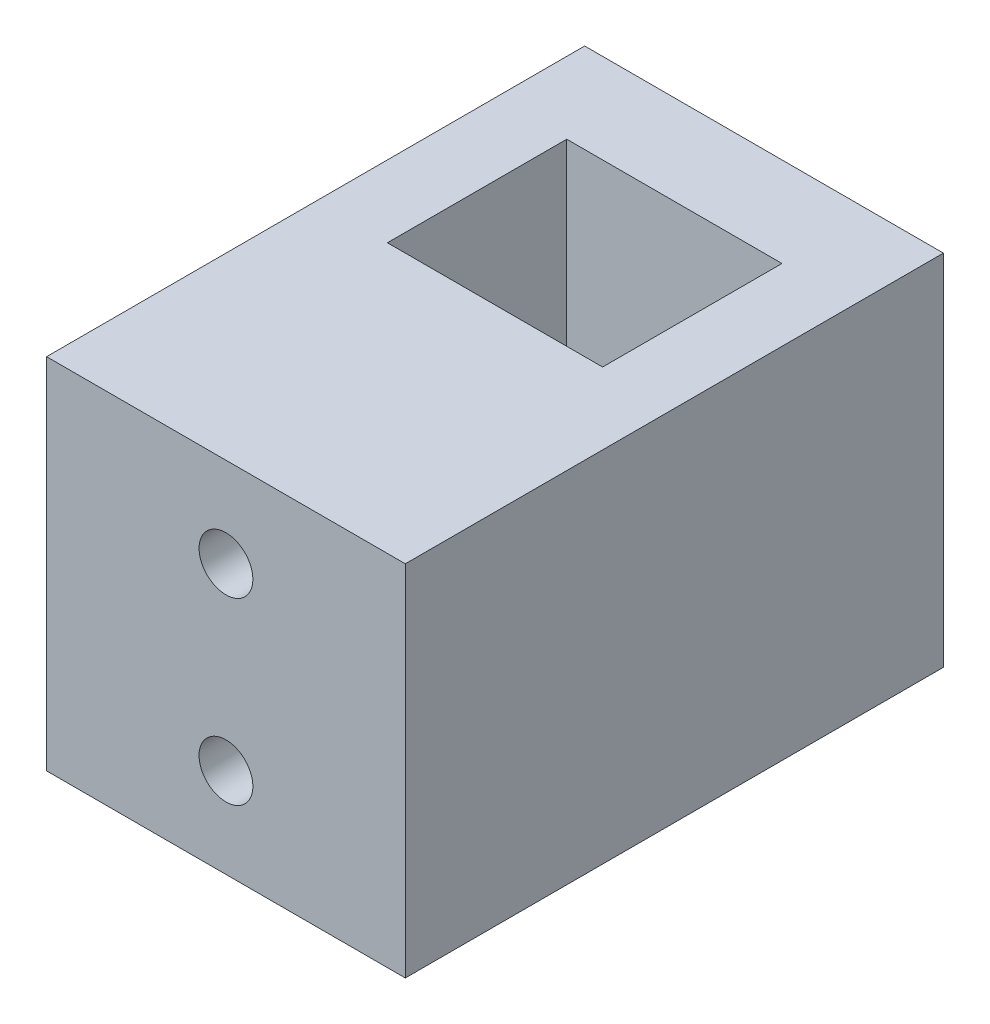
ISO-10303-21;
HEADER;
FILE_DESCRIPTION(('STEP AP214'),'2;1');
FILE_NAME('part.step','',(''),(''),'','','');
FILE_SCHEMA(('AUTOMOTIVE_DESIGN { 1 0 10303 214 1 1 1 1 }'));
ENDSEC;
DATA;
#1=APPLICATION_CONTEXT('core data for automotive mechanical design processes');
#2=APPLICATION_PROTOCOL_DEFINITION('international standard','automotive_design',2000,#1);
#3=PRODUCT_CONTEXT('',#1,'mechanical');
#4=PRODUCT('Part','Part','',(#3));
#5=PRODUCT_RELATED_PRODUCT_CATEGORY('part','',(#4));
#6=PRODUCT_DEFINITION_FORMATION('','',#4);
#7=PRODUCT_DEFINITION_CONTEXT('part definition',#1,'design');
#8=PRODUCT_DEFINITION('design','',#6,#7);
#9=PRODUCT_DEFINITION_SHAPE('','',#8);
#10=(LENGTH_UNIT() NAMED_UNIT(*) SI_UNIT(.MILLI.,.METRE.));
#11=(NAMED_UNIT(*) PLANE_ANGLE_UNIT() SI_UNIT($,.RADIAN.));
#12=(NAMED_UNIT(*) SI_UNIT($,.STERADIAN.) SOLID_ANGLE_UNIT());
#13=UNCERTAINTY_MEASURE_WITH_UNIT(LENGTH_MEASURE(1.E-05),#10,'distance_accuracy_value','');
#14=(GEOMETRIC_REPRESENTATION_CONTEXT(3) GLOBAL_UNCERTAINTY_ASSIGNED_CONTEXT((#13)) GLOBAL_UNIT_ASSIGNED_CONTEXT((#10,
#11,#12)) REPRESENTATION_CONTEXT('',''));
#15=CARTESIAN_POINT('',(0.,0.,0.));
#16=DIRECTION('',(0.,0.,1.));
#17=DIRECTION('',(1.,0.,0.));
#18=AXIS2_PLACEMENT_3D('',#15,#16,#17);
#19=CARTESIAN_POINT('',(10.,20.,-30.));
#20=DIRECTION('',(-1.,0.,0.));
#21=DIRECTION('',(0.,0.,1.));
#22=AXIS2_PLACEMENT_3D('',#19,#20,#21);
#23=PLANE('',#22);
#24=DIRECTION('',(0.,0.,-1.));
#25=VECTOR('',#24,1.);
#26=CARTESIAN_POINT('',(10.,0.,-30.));
#27=LINE('',#26,#25);
#28=CARTESIAN_POINT('',(10.,0.,0.));
#29=VERTEX_POINT('',#28);
#30=CARTESIAN_POINT('',(10.,0.,-30.));
#31=VERTEX_POINT('',#30);
#32=EDGE_CURVE('E145',#29,#31,#27,.T.);
#33=ORIENTED_EDGE('',*,*,#32,.T.);
#34=DIRECTION('',(0.,-1.,0.));
#35=VECTOR('',#34,1.);
#36=CARTESIAN_POINT('',(10.,20.,-30.));
#37=LINE('',#36,#35);
#38=CARTESIAN_POINT('',(10.,20.,-30.));
#39=VERTEX_POINT('',#38);
#40=EDGE_CURVE('E11',#39,#31,#37,.T.);
#41=ORIENTED_EDGE('',*,*,#40,.F.);
#42=DIRECTION('',(0.,0.,-1.));
#43=VECTOR('',#42,1.);
#44=CARTESIAN_POINT('',(10.,20.,-30.));
#45=LINE('',#44,#43);
#46=CARTESIAN_POINT('',(10.,20.,0.));
#47=VERTEX_POINT('',#46);
#48=EDGE_CURVE('E149',#47,#39,#45,.T.);
#49=ORIENTED_EDGE('',*,*,#48,.F.);
#50=DIRECTION('',(0.,-1.,0.));
#51=VECTOR('',#50,1.);
#52=CARTESIAN_POINT('',(10.,20.,0.));
#53=LINE('',#52,#51);
#54=EDGE_CURVE('E155',#47,#29,#53,.T.);
#55=ORIENTED_EDGE('',*,*,#54,.T.);
#56=EDGE_LOOP('',(#33,#41,#49,#55));
#57=FACE_BOUND('',#56,.T.);
#58=ADVANCED_FACE('F33',(#57),#23,.F.);
#59=CARTESIAN_POINT('',(-10.,20.,-30.));
#60=DIRECTION('',(0.,0.,1.));
#61=DIRECTION('',(1.,0.,0.));
#62=AXIS2_PLACEMENT_3D('',#59,#60,#61);
#63=PLANE('',#62);
#64=DIRECTION('',(-1.,0.,0.));
#65=VECTOR('',#64,1.);
#66=CARTESIAN_POINT('',(-10.,0.,-30.));
#67=LINE('',#66,#65);
#68=CARTESIAN_POINT('',(-10.,0.,-30.));
#69=VERTEX_POINT('',#68);
#70=EDGE_CURVE('E158',#31,#69,#67,.T.);
#71=ORIENTED_EDGE('',*,*,#70,.T.);
#72=DIRECTION('',(0.,-1.,0.));
#73=VECTOR('',#72,1.);
#74=CARTESIAN_POINT('',(-10.,20.,-30.));
#75=LINE('',#74,#73);
#76=CARTESIAN_POINT('',(-10.,20.,-30.));
#77=VERTEX_POINT('',#76);
#78=EDGE_CURVE('E41',#77,#69,#75,.T.);
#79=ORIENTED_EDGE('',*,*,#78,.F.);
#80=DIRECTION('',(-1.,0.,0.));
#81=VECTOR('',#80,1.);
#82=CARTESIAN_POINT('',(-10.,20.,-30.));
#83=LINE('',#82,#81);
#84=EDGE_CURVE('E85',#39,#77,#83,.T.);
#85=ORIENTED_EDGE('',*,*,#84,.F.);
#86=ORIENTED_EDGE('',*,*,#40,.T.);
#87=EDGE_LOOP('',(#71,#79,#85,#86));
#88=FACE_BOUND('',#87,.T.);
#89=ADVANCED_FACE('F189',(#88),#63,.F.);
#90=CARTESIAN_POINT('',(-10.,20.,-30.));
#91=DIRECTION('',(1.,0.,0.));
#92=DIRECTION('',(0.,0.,-1.));
#93=AXIS2_PLACEMENT_3D('',#90,#91,#92);
#94=PLANE('',#93);
#95=DIRECTION('',(0.,0.,1.));
#96=VECTOR('',#95,1.);
#97=CARTESIAN_POINT('',(-10.,0.,-30.));
#98=LINE('',#97,#96);
#99=CARTESIAN_POINT('',(-10.,0.,0.));
#100=VERTEX_POINT('',#99);
#101=EDGE_CURVE('E160',#69,#100,#98,.T.);
#102=ORIENTED_EDGE('',*,*,#101,.T.);
#103=DIRECTION('',(0.,-1.,0.));
#104=VECTOR('',#103,1.);
#105=CARTESIAN_POINT('',(-10.,20.,0.));
#106=LINE('',#105,#104);
#107=CARTESIAN_POINT('',(-10.,20.,0.));
#108=VERTEX_POINT('',#107);
#109=EDGE_CURVE('E164',#108,#100,#106,.T.);
#110=ORIENTED_EDGE('',*,*,#109,.F.);
#111=DIRECTION('',(0.,0.,1.));
#112=VECTOR('',#111,1.);
#113=CARTESIAN_POINT('',(-10.,20.,-30.));
#114=LINE('',#113,#112);
#115=EDGE_CURVE('E152',#77,#108,#114,.T.);
#116=ORIENTED_EDGE('',*,*,#115,.F.);
#117=ORIENTED_EDGE('',*,*,#78,.T.);
#118=EDGE_LOOP('',(#102,#110,#116,#117));
#119=FACE_BOUND('',#118,.T.);
#120=ADVANCED_FACE('F170',(#119),#94,.F.);
#121=CARTESIAN_POINT('',(-10.,20.,0.));
#122=DIRECTION('',(0.,0.,-1.));
#123=DIRECTION('',(-1.,0.,0.));
#124=AXIS2_PLACEMENT_3D('',#121,#122,#123);
#125=PLANE('',#124);
#126=CARTESIAN_POINT('',(0.,5.,0.));
#127=DIRECTION('',(0.,0.,1.));
#128=DIRECTION('',(-1.,0.,0.));
#129=AXIS2_PLACEMENT_3D('',#126,#127,#128);
#130=CIRCLE('',#129,1.5);
#131=CARTESIAN_POINT('',(-1.5,5.,0.));
#132=VERTEX_POINT('',#131);
#133=EDGE_CURVE('E325',#132,#132,#130,.T.);
#134=ORIENTED_EDGE('',*,*,#133,.F.);
#135=EDGE_LOOP('',(#134));
#136=FACE_BOUND('',#135,.T.);
#137=CARTESIAN_POINT('',(0.,15.,0.));
#138=DIRECTION('',(0.,0.,1.));
#139=DIRECTION('',(1.,0.,0.));
#140=AXIS2_PLACEMENT_3D('',#137,#138,#139);
#141=CIRCLE('',#140,1.5);
#142=CARTESIAN_POINT('',(1.5,15.,0.));
#143=VERTEX_POINT('',#142);
#144=EDGE_CURVE('E324',#143,#143,#141,.T.);
#145=ORIENTED_EDGE('',*,*,#144,.F.);
#146=EDGE_LOOP('',(#145));
#147=FACE_BOUND('',#146,.T.);
#148=DIRECTION('',(1.,0.,0.));
#149=VECTOR('',#148,1.);
#150=CARTESIAN_POINT('',(-10.,0.,0.));
#151=LINE('',#150,#149);
#152=EDGE_CURVE('E78',#100,#29,#151,.T.);
#153=ORIENTED_EDGE('',*,*,#152,.T.);
#154=ORIENTED_EDGE('',*,*,#54,.F.);
#155=DIRECTION('',(1.,0.,0.));
#156=VECTOR('',#155,1.);
#157=CARTESIAN_POINT('',(-10.,20.,0.));
#158=LINE('',#157,#156);
#159=EDGE_CURVE('E57',#108,#47,#158,.T.);
#160=ORIENTED_EDGE('',*,*,#159,.F.);
#161=ORIENTED_EDGE('',*,*,#109,.T.);
#162=EDGE_LOOP('',(#153,#154,#160,#161));
#163=FACE_BOUND('',#162,.T.);
#164=ADVANCED_FACE('F178',(#136,#147,#163),#125,.F.);
#165=CARTESIAN_POINT('',(0.,20.,0.));
#166=DIRECTION('',(0.,1.,0.));
#167=DIRECTION('',(0.,0.,1.));
#168=AXIS2_PLACEMENT_3D('',#165,#166,#167);
#169=PLANE('',#168);
#170=DIRECTION('',(0.,0.,-1.));
#171=VECTOR('',#170,1.);
#172=CARTESIAN_POINT('',(5.99999999999999,20.,-25.));
#173=LINE('',#172,#171);
#174=CARTESIAN_POINT('',(6.,20.,-15.));
#175=VERTEX_POINT('',#174);
#176=CARTESIAN_POINT('',(5.99999999999999,20.,-25.));
#177=VERTEX_POINT('',#176);
#178=EDGE_CURVE('E48',#175,#177,#173,.T.);
#179=ORIENTED_EDGE('',*,*,#178,.F.);
#180=DIRECTION('',(1.,0.,0.));
#181=VECTOR('',#180,1.);
#182=CARTESIAN_POINT('',(-6.00000000000001,20.,-15.));
#183=LINE('',#182,#181);
#184=CARTESIAN_POINT('',(-6.00000000000001,20.,-15.));
#185=VERTEX_POINT('',#184);
#186=EDGE_CURVE('E127',#185,#175,#183,.T.);
#187=ORIENTED_EDGE('',*,*,#186,.F.);
#188=DIRECTION('',(0.,0.,1.));
#189=VECTOR('',#188,1.);
#190=CARTESIAN_POINT('',(-6.00000000000001,20.,-25.));
#191=LINE('',#190,#189);
#192=CARTESIAN_POINT('',(-6.00000000000001,20.,-25.));
#193=VERTEX_POINT('',#192);
#194=EDGE_CURVE('E130',#193,#185,#191,.T.);
#195=ORIENTED_EDGE('',*,*,#194,.F.);
#196=DIRECTION('',(-1.,0.,0.));
#197=VECTOR('',#196,1.);
#198=CARTESIAN_POINT('',(-6.00000000000001,20.,-25.));
#199=LINE('',#198,#197);
#200=EDGE_CURVE('E139',#177,#193,#199,.T.);
#201=ORIENTED_EDGE('',*,*,#200,.F.);
#202=EDGE_LOOP('',(#179,#187,#195,#201));
#203=FACE_BOUND('',#202,.T.);
#204=ORIENTED_EDGE('',*,*,#48,.T.);
#205=ORIENTED_EDGE('',*,*,#84,.T.);
#206=ORIENTED_EDGE('',*,*,#115,.T.);
#207=ORIENTED_EDGE('',*,*,#159,.T.);
#208=EDGE_LOOP('',(#204,#205,#206,#207));
#209=FACE_BOUND('',#208,.T.);
#210=ADVANCED_FACE('F180',(#203,#209),#169,.T.);
#211=CARTESIAN_POINT('',(0.,0.,0.));
#212=DIRECTION('',(0.,1.,0.));
#213=DIRECTION('',(0.,0.,1.));
#214=AXIS2_PLACEMENT_3D('',#211,#212,#213);
#215=PLANE('',#214);
#216=CARTESIAN_POINT('',(0.,0.,-20.));
#217=DIRECTION('',(0.,1.,0.));
#218=DIRECTION('',(0.,0.,1.));
#219=AXIS2_PLACEMENT_3D('',#216,#217,#218);
#220=CIRCLE('',#219,1.5);
#221=CARTESIAN_POINT('',(0.,0.,-18.5));
#222=VERTEX_POINT('',#221);
#223=EDGE_CURVE('E133',#222,#222,#220,.T.);
#224=ORIENTED_EDGE('',*,*,#223,.T.);
#225=EDGE_LOOP('',(#224));
#226=FACE_BOUND('',#225,.T.);
#227=ORIENTED_EDGE('',*,*,#32,.F.);
#228=ORIENTED_EDGE('',*,*,#152,.F.);
#229=ORIENTED_EDGE('',*,*,#101,.F.);
#230=ORIENTED_EDGE('',*,*,#70,.F.);
#231=EDGE_LOOP('',(#227,#228,#229,#230));
#232=FACE_BOUND('',#231,.T.);
#233=ADVANCED_FACE('F174',(#226,#232),#215,.F.);
#234=CARTESIAN_POINT('',(5.99999999999999,2.,-25.));
#235=DIRECTION('',(1.,0.,0.));
#236=DIRECTION('',(0.,0.,-1.));
#237=AXIS2_PLACEMENT_3D('',#234,#235,#236);
#238=PLANE('',#237);
#239=ORIENTED_EDGE('',*,*,#178,.T.);
#240=DIRECTION('',(0.,1.,0.));
#241=VECTOR('',#240,1.);
#242=CARTESIAN_POINT('',(5.99999999999999,2.,-25.));
#243=LINE('',#242,#241);
#244=CARTESIAN_POINT('',(5.99999999999999,2.,-25.));
#245=VERTEX_POINT('',#244);
#246=EDGE_CURVE('E105',#245,#177,#243,.T.);
#247=ORIENTED_EDGE('',*,*,#246,.F.);
#248=DIRECTION('',(0.,0.,-1.));
#249=VECTOR('',#248,1.);
#250=CARTESIAN_POINT('',(5.99999999999999,2.,-25.));
#251=LINE('',#250,#249);
#252=CARTESIAN_POINT('',(6.,2.,-15.));
#253=VERTEX_POINT('',#252);
#254=EDGE_CURVE('E109',#253,#245,#251,.T.);
#255=ORIENTED_EDGE('',*,*,#254,.F.);
#256=DIRECTION('',(0.,1.,0.));
#257=VECTOR('',#256,1.);
#258=CARTESIAN_POINT('',(6.,2.,-15.));
#259=LINE('',#258,#257);
#260=EDGE_CURVE('E143',#253,#175,#259,.T.);
#261=ORIENTED_EDGE('',*,*,#260,.T.);
#262=EDGE_LOOP('',(#239,#247,#255,#261));
#263=FACE_BOUND('',#262,.T.);
#264=ADVANCED_FACE('F107',(#263),#238,.F.);
#265=CARTESIAN_POINT('',(-6.00000000000001,2.,-15.));
#266=DIRECTION('',(0.,0.,1.));
#267=DIRECTION('',(1.,0.,0.));
#268=AXIS2_PLACEMENT_3D('',#265,#266,#267);
#269=PLANE('',#268);
#270=ORIENTED_EDGE('',*,*,#186,.T.);
#271=ORIENTED_EDGE('',*,*,#260,.F.);
#272=DIRECTION('',(1.,0.,0.));
#273=VECTOR('',#272,1.);
#274=CARTESIAN_POINT('',(-6.00000000000001,2.,-15.));
#275=LINE('',#274,#273);
#276=CARTESIAN_POINT('',(-6.00000000000001,2.,-15.));
#277=VERTEX_POINT('',#276);
#278=EDGE_CURVE('E115',#277,#253,#275,.T.);
#279=ORIENTED_EDGE('',*,*,#278,.F.);
#280=DIRECTION('',(0.,1.,0.));
#281=VECTOR('',#280,1.);
#282=CARTESIAN_POINT('',(-6.00000000000001,2.,-15.));
#283=LINE('',#282,#281);
#284=EDGE_CURVE('E146',#277,#185,#283,.T.);
#285=ORIENTED_EDGE('',*,*,#284,.T.);
#286=EDGE_LOOP('',(#270,#271,#279,#285));
#287=FACE_BOUND('',#286,.T.);
#288=ADVANCED_FACE('F222',(#287),#269,.F.);
#289=CARTESIAN_POINT('',(-6.00000000000001,2.,-25.));
#290=DIRECTION('',(-1.,0.,0.));
#291=DIRECTION('',(0.,0.,1.));
#292=AXIS2_PLACEMENT_3D('',#289,#290,#291);
#293=PLANE('',#292);
#294=ORIENTED_EDGE('',*,*,#194,.T.);
#295=ORIENTED_EDGE('',*,*,#284,.F.);
#296=DIRECTION('',(0.,0.,1.));
#297=VECTOR('',#296,1.);
#298=CARTESIAN_POINT('',(-6.00000000000001,2.,-25.));
#299=LINE('',#298,#297);
#300=CARTESIAN_POINT('',(-6.00000000000001,2.,-25.));
#301=VERTEX_POINT('',#300);
#302=EDGE_CURVE('E123',#301,#277,#299,.T.);
#303=ORIENTED_EDGE('',*,*,#302,.F.);
#304=DIRECTION('',(0.,1.,0.));
#305=VECTOR('',#304,1.);
#306=CARTESIAN_POINT('',(-6.00000000000001,2.,-25.));
#307=LINE('',#306,#305);
#308=EDGE_CURVE('E114',#301,#193,#307,.T.);
#309=ORIENTED_EDGE('',*,*,#308,.T.);
#310=EDGE_LOOP('',(#294,#295,#303,#309));
#311=FACE_BOUND('',#310,.T.);
#312=ADVANCED_FACE('F231',(#311),#293,.F.);
#313=CARTESIAN_POINT('',(-6.00000000000001,2.,-25.));
#314=DIRECTION('',(0.,0.,-1.));
#315=DIRECTION('',(-1.,0.,0.));
#316=AXIS2_PLACEMENT_3D('',#313,#314,#315);
#317=PLANE('',#316);
#318=ORIENTED_EDGE('',*,*,#200,.T.);
#319=ORIENTED_EDGE('',*,*,#308,.F.);
#320=DIRECTION('',(-1.,0.,0.));
#321=VECTOR('',#320,1.);
#322=CARTESIAN_POINT('',(-6.00000000000001,2.,-25.));
#323=LINE('',#322,#321);
#324=EDGE_CURVE('E118',#245,#301,#323,.T.);
#325=ORIENTED_EDGE('',*,*,#324,.F.);
#326=ORIENTED_EDGE('',*,*,#246,.T.);
#327=EDGE_LOOP('',(#318,#319,#325,#326));
#328=FACE_BOUND('',#327,.T.);
#329=ADVANCED_FACE('F119',(#328),#317,.F.);
#330=CARTESIAN_POINT('',(0.,2.,0.));
#331=DIRECTION('',(0.,1.,0.));
#332=DIRECTION('',(0.,0.,1.));
#333=AXIS2_PLACEMENT_3D('',#330,#331,#332);
#334=PLANE('',#333);
#335=CARTESIAN_POINT('',(0.,2.,-20.));
#336=DIRECTION('',(0.,1.,0.));
#337=DIRECTION('',(0.,0.,1.));
#338=AXIS2_PLACEMENT_3D('',#335,#336,#337);
#339=CIRCLE('',#338,1.5);
#340=CARTESIAN_POINT('',(0.,2.,-18.5));
#341=VERTEX_POINT('',#340);
#342=EDGE_CURVE('E36',#341,#341,#339,.F.);
#343=ORIENTED_EDGE('',*,*,#342,.T.);
#344=EDGE_LOOP('',(#343));
#345=FACE_BOUND('',#344,.T.);
#346=ORIENTED_EDGE('',*,*,#254,.T.);
#347=ORIENTED_EDGE('',*,*,#324,.T.);
#348=ORIENTED_EDGE('',*,*,#302,.T.);
#349=ORIENTED_EDGE('',*,*,#278,.T.);
#350=EDGE_LOOP('',(#346,#347,#348,#349));
#351=FACE_BOUND('',#350,.T.);
#352=ADVANCED_FACE('F125',(#345,#351),#334,.T.);
#353=CARTESIAN_POINT('',(0.,20.,-20.));
#354=DIRECTION('',(0.,-1.,0.));
#355=DIRECTION('',(0.,0.,-1.));
#356=AXIS2_PLACEMENT_3D('',#353,#354,#355);
#357=CYLINDRICAL_SURFACE('',#356,1.5);
#358=ORIENTED_EDGE('',*,*,#342,.F.);
#359=EDGE_LOOP('',(#358));
#360=FACE_BOUND('',#359,.T.);
#361=ORIENTED_EDGE('',*,*,#223,.F.);
#362=EDGE_LOOP('',(#361));
#363=FACE_BOUND('',#362,.T.);
#364=ADVANCED_FACE('F264',(#360,#363),#357,.F.);
#365=CARTESIAN_POINT('',(0.,15.,-10.));
#366=DIRECTION('',(0.,0.,1.));
#367=DIRECTION('',(1.,0.,0.));
#368=AXIS2_PLACEMENT_3D('',#365,#366,#367);
#369=CYLINDRICAL_SURFACE('',#368,1.5);
#370=CARTESIAN_POINT('',(0.,15.,-10.));
#371=DIRECTION('',(0.,0.,1.));
#372=DIRECTION('',(1.,0.,0.));
#373=AXIS2_PLACEMENT_3D('',#370,#371,#372);
#374=CIRCLE('',#373,1.5);
#375=CARTESIAN_POINT('',(1.5,15.,-10.));
#376=VERTEX_POINT('',#375);
#377=EDGE_CURVE('E328',#376,#376,#374,.T.);
#378=ORIENTED_EDGE('',*,*,#377,.F.);
#379=EDGE_LOOP('',(#378));
#380=FACE_BOUND('',#379,.T.);
#381=ORIENTED_EDGE('',*,*,#144,.T.);
#382=EDGE_LOOP('',(#381));
#383=FACE_BOUND('',#382,.T.);
#384=ADVANCED_FACE('F273',(#380,#383),#369,.F.);
#385=CARTESIAN_POINT('',(0.,15.,-10.));
#386=DIRECTION('',(0.,0.,1.));
#387=DIRECTION('',(1.,0.,0.));
#388=AXIS2_PLACEMENT_3D('',#385,#386,#387);
#389=PLANE('',#388);
#390=ORIENTED_EDGE('',*,*,#377,.T.);
#391=EDGE_LOOP('',(#390));
#392=FACE_BOUND('',#391,.T.);
#393=ADVANCED_FACE('F287',(#392),#389,.T.);
#394=CARTESIAN_POINT('',(0.,5.,-10.));
#395=DIRECTION('',(0.,0.,1.));
#396=DIRECTION('',(1.,0.,0.));
#397=AXIS2_PLACEMENT_3D('',#394,#395,#396);
#398=CYLINDRICAL_SURFACE('',#397,1.5);
#399=CARTESIAN_POINT('',(0.,5.,-10.));
#400=DIRECTION('',(0.,0.,1.));
#401=DIRECTION('',(-1.,0.,0.));
#402=AXIS2_PLACEMENT_3D('',#399,#400,#401);
#403=CIRCLE('',#402,1.5);
#404=CARTESIAN_POINT('',(-1.5,5.,-10.));
#405=VERTEX_POINT('',#404);
#406=EDGE_CURVE('E323',#405,#405,#403,.T.);
#407=ORIENTED_EDGE('',*,*,#406,.F.);
#408=EDGE_LOOP('',(#407));
#409=FACE_BOUND('',#408,.T.);
#410=ORIENTED_EDGE('',*,*,#133,.T.);
#411=EDGE_LOOP('',(#410));
#412=FACE_BOUND('',#411,.T.);
#413=ADVANCED_FACE('F297',(#409,#412),#398,.F.);
#414=CARTESIAN_POINT('',(0.,5.,-10.));
#415=DIRECTION('',(0.,0.,-1.));
#416=DIRECTION('',(-1.,0.,0.));
#417=AXIS2_PLACEMENT_3D('',#414,#415,#416);
#418=PLANE('',#417);
#419=ORIENTED_EDGE('',*,*,#406,.T.);
#420=EDGE_LOOP('',(#419));
#421=FACE_BOUND('',#420,.T.);
#422=ADVANCED_FACE('F307',(#421),#418,.F.);
#423=CLOSED_SHELL('',(#58,#89,#120,#164,#210,#233,#264,#288,#312,#329,#352,#364,#384,#393,#413,#422));
#424=MANIFOLD_SOLID_BREP('B2',#423);
#425=ADVANCED_BREP_SHAPE_REPRESENTATION('',(#18,#424),#14);
#426=SHAPE_DEFINITION_REPRESENTATION(#9,#425);
ENDSEC;
END-ISO-10303-21;
